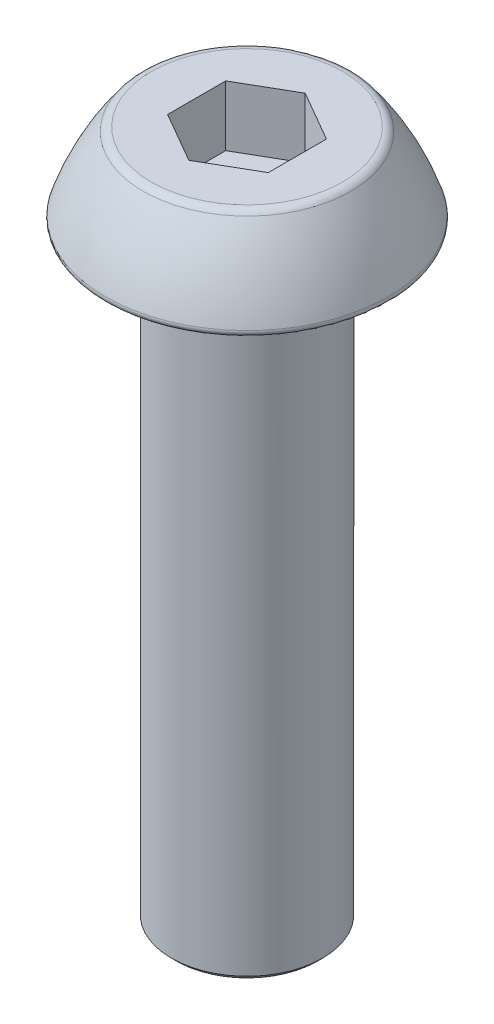
ISO-10303-21;
HEADER;
FILE_DESCRIPTION(('STEP AP214'),'2;1');
FILE_NAME('part.step','',(''),(''),'','','');
FILE_SCHEMA(('AUTOMOTIVE_DESIGN { 1 0 10303 214 1 1 1 1 }'));
ENDSEC;
DATA;
#1=APPLICATION_CONTEXT('core data for automotive mechanical design processes');
#2=APPLICATION_PROTOCOL_DEFINITION('international standard','automotive_design',2000,#1);
#3=PRODUCT_CONTEXT('',#1,'mechanical');
#4=PRODUCT('Part','Part','',(#3));
#5=PRODUCT_RELATED_PRODUCT_CATEGORY('part','',(#4));
#6=PRODUCT_DEFINITION_FORMATION('','',#4);
#7=PRODUCT_DEFINITION_CONTEXT('part definition',#1,'design');
#8=PRODUCT_DEFINITION('design','',#6,#7);
#9=PRODUCT_DEFINITION_SHAPE('','',#8);
#10=(LENGTH_UNIT() NAMED_UNIT(*) SI_UNIT(.MILLI.,.METRE.));
#11=(NAMED_UNIT(*) PLANE_ANGLE_UNIT() SI_UNIT($,.RADIAN.));
#12=(NAMED_UNIT(*) SI_UNIT($,.STERADIAN.) SOLID_ANGLE_UNIT());
#13=UNCERTAINTY_MEASURE_WITH_UNIT(LENGTH_MEASURE(1.E-05),#10,'distance_accuracy_value','');
#14=(GEOMETRIC_REPRESENTATION_CONTEXT(3) GLOBAL_UNCERTAINTY_ASSIGNED_CONTEXT((#13)) GLOBAL_UNIT_ASSIGNED_CONTEXT((#10,
#11,#12)) REPRESENTATION_CONTEXT('',''));
#15=CARTESIAN_POINT('',(0.,0.,0.));
#16=DIRECTION('',(0.,0.,1.));
#17=DIRECTION('',(1.,0.,0.));
#18=AXIS2_PLACEMENT_3D('',#15,#16,#17);
#19=CARTESIAN_POINT('',(0.,0.,0.));
#20=DIRECTION('',(0.,1.,0.));
#21=DIRECTION('',(0.,0.,1.));
#22=AXIS2_PLACEMENT_3D('',#19,#20,#21);
#23=PLANE('',#22);
#24=CARTESIAN_POINT('',(0.,0.,0.));
#25=DIRECTION('',(0.,1.,0.));
#26=DIRECTION('',(0.,0.,1.));
#27=AXIS2_PLACEMENT_3D('',#24,#25,#26);
#28=CIRCLE('',#27,2.71401101775283);
#29=CARTESIAN_POINT('',(0.,0.,2.71401101775283));
#30=VERTEX_POINT('',#29);
#31=EDGE_CURVE('E118',#30,#30,#28,.F.);
#32=ORIENTED_EDGE('',*,*,#31,.T.);
#33=EDGE_LOOP('',(#32));
#34=FACE_BOUND('',#33,.T.);
#35=CARTESIAN_POINT('',(0.,0.,0.));
#36=DIRECTION('',(0.,1.,0.));
#37=DIRECTION('',(0.,0.,1.));
#38=AXIS2_PLACEMENT_3D('',#35,#36,#37);
#39=CIRCLE('',#38,1.5);
#40=CARTESIAN_POINT('',(0.,0.,1.5));
#41=VERTEX_POINT('',#40);
#42=EDGE_CURVE('E137',#41,#41,#39,.F.);
#43=ORIENTED_EDGE('',*,*,#42,.F.);
#44=EDGE_LOOP('',(#43));
#45=FACE_BOUND('',#44,.T.);
#46=ADVANCED_FACE('F17',(#34,#45),#23,.F.);
#47=CARTESIAN_POINT('',(-2.,1.65,0.));
#48=DIRECTION('',(0.,-1.,0.));
#49=DIRECTION('',(0.,0.,-1.));
#50=AXIS2_PLACEMENT_3D('',#47,#48,#49);
#51=PLANE('',#50);
#52=DIRECTION('',(-0.866025403784439,0.,0.5));
#53=VECTOR('',#52,1.);
#54=CARTESIAN_POINT('',(0.,1.65,-1.15470053837925));
#55=LINE('',#54,#53);
#56=CARTESIAN_POINT('',(0.,1.65,-1.15470053837925));
#57=VERTEX_POINT('',#56);
#58=CARTESIAN_POINT('',(-1.,1.65,-0.577350269189626));
#59=VERTEX_POINT('',#58);
#60=EDGE_CURVE('E106',#57,#59,#55,.T.);
#61=ORIENTED_EDGE('',*,*,#60,.F.);
#62=DIRECTION('',(-0.866025403784439,0.,-0.5));
#63=VECTOR('',#62,1.);
#64=CARTESIAN_POINT('',(1.,1.65,-0.577350269189626));
#65=LINE('',#64,#63);
#66=CARTESIAN_POINT('',(1.,1.65,-0.577350269189626));
#67=VERTEX_POINT('',#66);
#68=EDGE_CURVE('E32',#67,#57,#65,.T.);
#69=ORIENTED_EDGE('',*,*,#68,.F.);
#70=DIRECTION('',(0.,0.,-1.));
#71=VECTOR('',#70,1.);
#72=CARTESIAN_POINT('',(1.,1.65,0.577350269189626));
#73=LINE('',#72,#71);
#74=CARTESIAN_POINT('',(1.,1.65,0.577350269189626));
#75=VERTEX_POINT('',#74);
#76=EDGE_CURVE('E113',#75,#67,#73,.T.);
#77=ORIENTED_EDGE('',*,*,#76,.F.);
#78=DIRECTION('',(0.866025403784439,0.,-0.5));
#79=VECTOR('',#78,1.);
#80=CARTESIAN_POINT('',(0.,1.65,1.15470053837925));
#81=LINE('',#80,#79);
#82=CARTESIAN_POINT('',(0.,1.65,1.15470053837925));
#83=VERTEX_POINT('',#82);
#84=EDGE_CURVE('E114',#83,#75,#81,.T.);
#85=ORIENTED_EDGE('',*,*,#84,.F.);
#86=DIRECTION('',(0.866025403784439,0.,0.5));
#87=VECTOR('',#86,1.);
#88=CARTESIAN_POINT('',(-1.,1.65,0.577350269189626));
#89=LINE('',#88,#87);
#90=CARTESIAN_POINT('',(-1.,1.65,0.577350269189626));
#91=VERTEX_POINT('',#90);
#92=EDGE_CURVE('E79',#91,#83,#89,.T.);
#93=ORIENTED_EDGE('',*,*,#92,.F.);
#94=DIRECTION('',(0.,0.,1.));
#95=VECTOR('',#94,1.);
#96=CARTESIAN_POINT('',(-1.,1.65,-0.577350269189626));
#97=LINE('',#96,#95);
#98=EDGE_CURVE('E108',#59,#91,#97,.T.);
#99=ORIENTED_EDGE('',*,*,#98,.F.);
#100=EDGE_LOOP('',(#61,#69,#77,#85,#93,#99));
#101=FACE_BOUND('',#100,.T.);
#102=CARTESIAN_POINT('',(0.,1.65,0.));
#103=DIRECTION('',(0.,-1.,0.));
#104=DIRECTION('',(0.,0.,-1.));
#105=AXIS2_PLACEMENT_3D('',#102,#103,#104);
#106=CIRCLE('',#105,1.90110924353599);
#107=CARTESIAN_POINT('',(0.,1.65,-1.90110924353599));
#108=VERTEX_POINT('',#107);
#109=EDGE_CURVE('E132',#108,#108,#106,.F.);
#110=ORIENTED_EDGE('',*,*,#109,.T.);
#111=EDGE_LOOP('',(#110));
#112=FACE_BOUND('',#111,.T.);
#113=ADVANCED_FACE('F152',(#101,#112),#51,.F.);
#114=CARTESIAN_POINT('',(0.,-1.42499576680782,0.));
#115=DIRECTION('',(0.,-1.,0.));
#116=DIRECTION('',(0.,0.,-1.));
#117=AXIS2_PLACEMENT_3D('',#114,#115,#116);
#118=DEGENERATE_TOROIDAL_SURFACE('',#117,1.94263884145048,5.,.F.);
#119=CARTESIAN_POINT('',(0.,1.56979149028366,0.));
#120=DIRECTION('',(0.,-1.,0.));
#121=DIRECTION('',(0.,0.,-1.));
#122=AXIS2_PLACEMENT_3D('',#119,#120,#121);
#123=CIRCLE('',#122,2.06126541374375);
#124=CARTESIAN_POINT('',(0.,1.56979149028366,-2.06126541374375));
#125=VERTEX_POINT('',#124);
#126=EDGE_CURVE('E129',#125,#125,#123,.T.);
#127=ORIENTED_EDGE('',*,*,#126,.T.);
#128=EDGE_LOOP('',(#127));
#129=FACE_BOUND('',#128,.T.);
#130=CARTESIAN_POINT('',(0.,0.131122362587915,0.));
#131=DIRECTION('',(0.,-1.,0.));
#132=DIRECTION('',(0.,0.,-1.));
#133=AXIS2_PLACEMENT_3D('',#130,#131,#132);
#134=CIRCLE('',#133,2.80904468834882);
#135=CARTESIAN_POINT('',(0.,0.131122362587915,-2.80904468834882));
#136=VERTEX_POINT('',#135);
#137=EDGE_CURVE('E126',#136,#136,#134,.F.);
#138=ORIENTED_EDGE('',*,*,#137,.T.);
#139=EDGE_LOOP('',(#138));
#140=FACE_BOUND('',#139,.T.);
#141=ADVANCED_FACE('F161',(#129,#140),#118,.F.);
#142=CARTESIAN_POINT('',(0.,0.1,0.));
#143=DIRECTION('',(0.,1.,0.));
#144=DIRECTION('',(0.,0.,1.));
#145=AXIS2_PLACEMENT_3D('',#142,#143,#144);
#146=TOROIDAL_SURFACE('',#145,2.71401101775283,0.1);
#147=ORIENTED_EDGE('',*,*,#137,.F.);
#148=EDGE_LOOP('',(#147));
#149=FACE_BOUND('',#148,.T.);
#150=ORIENTED_EDGE('',*,*,#31,.F.);
#151=EDGE_LOOP('',(#150));
#152=FACE_BOUND('',#151,.T.);
#153=ADVANCED_FACE('F168',(#149,#152),#146,.T.);
#154=CARTESIAN_POINT('',(0.,1.45,0.));
#155=DIRECTION('',(0.,-1.,0.));
#156=DIRECTION('',(0.,0.,-1.));
#157=AXIS2_PLACEMENT_3D('',#154,#155,#156);
#158=TOROIDAL_SURFACE('',#157,1.90110924353599,0.2);
#159=ORIENTED_EDGE('',*,*,#109,.F.);
#160=EDGE_LOOP('',(#159));
#161=FACE_BOUND('',#160,.T.);
#162=ORIENTED_EDGE('',*,*,#126,.F.);
#163=EDGE_LOOP('',(#162));
#164=FACE_BOUND('',#163,.T.);
#165=ADVANCED_FACE('F173',(#161,#164),#158,.T.);
#166=CARTESIAN_POINT('',(1.,0.45,-0.577350269189626));
#167=DIRECTION('',(0.5,0.,-0.866025403784439));
#168=DIRECTION('',(-0.866025403784439,0.,-0.5));
#169=AXIS2_PLACEMENT_3D('',#166,#167,#168);
#170=PLANE('',#169);
#171=ORIENTED_EDGE('',*,*,#68,.T.);
#172=DIRECTION('',(0.,1.,0.));
#173=VECTOR('',#172,1.);
#174=CARTESIAN_POINT('',(0.,0.45,-1.15470053837925));
#175=LINE('',#174,#173);
#176=CARTESIAN_POINT('',(0.,0.45,-1.15470053837925));
#177=VERTEX_POINT('',#176);
#178=EDGE_CURVE('E62',#177,#57,#175,.T.);
#179=ORIENTED_EDGE('',*,*,#178,.F.);
#180=DIRECTION('',(-0.866025403784439,0.,-0.5));
#181=VECTOR('',#180,1.);
#182=CARTESIAN_POINT('',(1.,0.45,-0.577350269189626));
#183=LINE('',#182,#181);
#184=CARTESIAN_POINT('',(1.,0.45,-0.577350269189626));
#185=VERTEX_POINT('',#184);
#186=EDGE_CURVE('E117',#185,#177,#183,.T.);
#187=ORIENTED_EDGE('',*,*,#186,.F.);
#188=DIRECTION('',(0.,1.,0.));
#189=VECTOR('',#188,1.);
#190=CARTESIAN_POINT('',(1.,0.45,-0.577350269189626));
#191=LINE('',#190,#189);
#192=EDGE_CURVE('E37',#185,#67,#191,.T.);
#193=ORIENTED_EDGE('',*,*,#192,.T.);
#194=EDGE_LOOP('',(#171,#179,#187,#193));
#195=FACE_BOUND('',#194,.T.);
#196=ADVANCED_FACE('F170',(#195),#170,.F.);
#197=CARTESIAN_POINT('',(1.,0.45,0.577350269189626));
#198=DIRECTION('',(1.,0.,0.));
#199=DIRECTION('',(0.,0.,-1.));
#200=AXIS2_PLACEMENT_3D('',#197,#198,#199);
#201=PLANE('',#200);
#202=ORIENTED_EDGE('',*,*,#76,.T.);
#203=ORIENTED_EDGE('',*,*,#192,.F.);
#204=DIRECTION('',(0.,0.,-1.));
#205=VECTOR('',#204,1.);
#206=CARTESIAN_POINT('',(1.,0.45,0.577350269189626));
#207=LINE('',#206,#205);
#208=CARTESIAN_POINT('',(1.,0.45,0.577350269189626));
#209=VERTEX_POINT('',#208);
#210=EDGE_CURVE('E95',#209,#185,#207,.T.);
#211=ORIENTED_EDGE('',*,*,#210,.F.);
#212=DIRECTION('',(0.,1.,0.));
#213=VECTOR('',#212,1.);
#214=CARTESIAN_POINT('',(1.,0.45,0.577350269189626));
#215=LINE('',#214,#213);
#216=EDGE_CURVE('E81',#209,#75,#215,.T.);
#217=ORIENTED_EDGE('',*,*,#216,.T.);
#218=EDGE_LOOP('',(#202,#203,#211,#217));
#219=FACE_BOUND('',#218,.T.);
#220=ADVANCED_FACE('F181',(#219),#201,.F.);
#221=CARTESIAN_POINT('',(0.,0.45,1.15470053837925));
#222=DIRECTION('',(0.5,0.,0.866025403784439));
#223=DIRECTION('',(0.866025403784439,0.,-0.5));
#224=AXIS2_PLACEMENT_3D('',#221,#222,#223);
#225=PLANE('',#224);
#226=ORIENTED_EDGE('',*,*,#84,.T.);
#227=ORIENTED_EDGE('',*,*,#216,.F.);
#228=DIRECTION('',(0.866025403784439,0.,-0.5));
#229=VECTOR('',#228,1.);
#230=CARTESIAN_POINT('',(0.,0.45,1.15470053837925));
#231=LINE('',#230,#229);
#232=CARTESIAN_POINT('',(0.,0.45,1.15470053837925));
#233=VERTEX_POINT('',#232);
#234=EDGE_CURVE('E86',#233,#209,#231,.T.);
#235=ORIENTED_EDGE('',*,*,#234,.F.);
#236=DIRECTION('',(0.,1.,0.));
#237=VECTOR('',#236,1.);
#238=CARTESIAN_POINT('',(0.,0.45,1.15470053837925));
#239=LINE('',#238,#237);
#240=EDGE_CURVE('E73',#233,#83,#239,.T.);
#241=ORIENTED_EDGE('',*,*,#240,.T.);
#242=EDGE_LOOP('',(#226,#227,#235,#241));
#243=FACE_BOUND('',#242,.T.);
#244=ADVANCED_FACE('F90',(#243),#225,.F.);
#245=CARTESIAN_POINT('',(-1.,0.45,0.577350269189626));
#246=DIRECTION('',(-0.5,0.,0.866025403784439));
#247=DIRECTION('',(0.866025403784439,0.,0.5));
#248=AXIS2_PLACEMENT_3D('',#245,#246,#247);
#249=PLANE('',#248);
#250=ORIENTED_EDGE('',*,*,#92,.T.);
#251=ORIENTED_EDGE('',*,*,#240,.F.);
#252=DIRECTION('',(0.866025403784439,0.,0.5));
#253=VECTOR('',#252,1.);
#254=CARTESIAN_POINT('',(-1.,0.45,0.577350269189626));
#255=LINE('',#254,#253);
#256=CARTESIAN_POINT('',(-1.,0.45,0.577350269189626));
#257=VERTEX_POINT('',#256);
#258=EDGE_CURVE('E80',#257,#233,#255,.T.);
#259=ORIENTED_EDGE('',*,*,#258,.F.);
#260=DIRECTION('',(0.,1.,0.));
#261=VECTOR('',#260,1.);
#262=CARTESIAN_POINT('',(-1.,0.45,0.577350269189626));
#263=LINE('',#262,#261);
#264=EDGE_CURVE('E83',#257,#91,#263,.T.);
#265=ORIENTED_EDGE('',*,*,#264,.T.);
#266=EDGE_LOOP('',(#250,#251,#259,#265));
#267=FACE_BOUND('',#266,.T.);
#268=ADVANCED_FACE('F74',(#267),#249,.F.);
#269=CARTESIAN_POINT('',(-1.,0.45,-0.577350269189626));
#270=DIRECTION('',(-1.,0.,0.));
#271=DIRECTION('',(0.,0.,1.));
#272=AXIS2_PLACEMENT_3D('',#269,#270,#271);
#273=PLANE('',#272);
#274=ORIENTED_EDGE('',*,*,#98,.T.);
#275=ORIENTED_EDGE('',*,*,#264,.F.);
#276=DIRECTION('',(0.,0.,1.));
#277=VECTOR('',#276,1.);
#278=CARTESIAN_POINT('',(-1.,0.45,-0.577350269189626));
#279=LINE('',#278,#277);
#280=CARTESIAN_POINT('',(-1.,0.45,-0.577350269189626));
#281=VERTEX_POINT('',#280);
#282=EDGE_CURVE('E98',#281,#257,#279,.T.);
#283=ORIENTED_EDGE('',*,*,#282,.F.);
#284=DIRECTION('',(0.,1.,0.));
#285=VECTOR('',#284,1.);
#286=CARTESIAN_POINT('',(-1.,0.45,-0.577350269189626));
#287=LINE('',#286,#285);
#288=EDGE_CURVE('E121',#281,#59,#287,.T.);
#289=ORIENTED_EDGE('',*,*,#288,.T.);
#290=EDGE_LOOP('',(#274,#275,#283,#289));
#291=FACE_BOUND('',#290,.T.);
#292=ADVANCED_FACE('F206',(#291),#273,.F.);
#293=CARTESIAN_POINT('',(0.,0.45,-1.15470053837925));
#294=DIRECTION('',(-0.5,0.,-0.866025403784439));
#295=DIRECTION('',(-0.866025403784439,0.,0.5));
#296=AXIS2_PLACEMENT_3D('',#293,#294,#295);
#297=PLANE('',#296);
#298=ORIENTED_EDGE('',*,*,#60,.T.);
#299=ORIENTED_EDGE('',*,*,#288,.F.);
#300=DIRECTION('',(-0.866025403784439,0.,0.5));
#301=VECTOR('',#300,1.);
#302=CARTESIAN_POINT('',(0.,0.45,-1.15470053837925));
#303=LINE('',#302,#301);
#304=EDGE_CURVE('E99',#177,#281,#303,.T.);
#305=ORIENTED_EDGE('',*,*,#304,.F.);
#306=ORIENTED_EDGE('',*,*,#178,.T.);
#307=EDGE_LOOP('',(#298,#299,#305,#306));
#308=FACE_BOUND('',#307,.T.);
#309=ADVANCED_FACE('F208',(#308),#297,.F.);
#310=CARTESIAN_POINT('',(0.,0.45,0.));
#311=DIRECTION('',(0.,1.,0.));
#312=DIRECTION('',(0.,0.,1.));
#313=AXIS2_PLACEMENT_3D('',#310,#311,#312);
#314=PLANE('',#313);
#315=ORIENTED_EDGE('',*,*,#186,.T.);
#316=ORIENTED_EDGE('',*,*,#304,.T.);
#317=ORIENTED_EDGE('',*,*,#282,.T.);
#318=ORIENTED_EDGE('',*,*,#258,.T.);
#319=ORIENTED_EDGE('',*,*,#234,.T.);
#320=ORIENTED_EDGE('',*,*,#210,.T.);
#321=EDGE_LOOP('',(#315,#316,#317,#318,#319,#320));
#322=FACE_BOUND('',#321,.T.);
#323=ADVANCED_FACE('F92',(#322),#314,.T.);
#324=CARTESIAN_POINT('',(0.,-12.,0.));
#325=DIRECTION('',(0.,1.,0.));
#326=DIRECTION('',(0.,0.,1.));
#327=AXIS2_PLACEMENT_3D('',#324,#325,#326);
#328=CYLINDRICAL_SURFACE('',#327,1.5);
#329=CARTESIAN_POINT('',(0.,-11.9,0.));
#330=DIRECTION('',(0.,-1.,0.));
#331=DIRECTION('',(0.,0.,-1.));
#332=AXIS2_PLACEMENT_3D('',#329,#330,#331);
#333=CIRCLE('',#332,1.5);
#334=CARTESIAN_POINT('',(0.,-11.9,-1.5));
#335=VERTEX_POINT('',#334);
#336=EDGE_CURVE('E11',#335,#335,#333,.F.);
#337=ORIENTED_EDGE('',*,*,#336,.T.);
#338=EDGE_LOOP('',(#337));
#339=FACE_BOUND('',#338,.T.);
#340=ORIENTED_EDGE('',*,*,#42,.T.);
#341=EDGE_LOOP('',(#340));
#342=FACE_BOUND('',#341,.T.);
#343=ADVANCED_FACE('F147',(#339,#342),#328,.T.);
#344=CARTESIAN_POINT('',(0.,-12.,0.));
#345=DIRECTION('',(0.,-1.,0.));
#346=DIRECTION('',(0.,0.,-1.));
#347=AXIS2_PLACEMENT_3D('',#344,#345,#346);
#348=PLANE('',#347);
#349=CARTESIAN_POINT('',(0.,-12.,0.));
#350=DIRECTION('',(0.,-1.,0.));
#351=DIRECTION('',(0.,0.,-1.));
#352=AXIS2_PLACEMENT_3D('',#349,#350,#351);
#353=CIRCLE('',#352,1.4);
#354=CARTESIAN_POINT('',(0.,-12.,-1.4));
#355=VERTEX_POINT('',#354);
#356=EDGE_CURVE('E25',#355,#355,#353,.T.);
#357=ORIENTED_EDGE('',*,*,#356,.T.);
#358=EDGE_LOOP('',(#357));
#359=FACE_BOUND('',#358,.T.);
#360=ADVANCED_FACE('F143',(#359),#348,.T.);
#361=CARTESIAN_POINT('',(0.,-12.,0.));
#362=DIRECTION('',(0.,1.,0.));
#363=DIRECTION('',(0.,0.,1.));
#364=AXIS2_PLACEMENT_3D('',#361,#362,#363);
#365=CONICAL_SURFACE('',#364,1.4,0.785398163397452);
#366=ORIENTED_EDGE('',*,*,#336,.F.);
#367=EDGE_LOOP('',(#366));
#368=FACE_BOUND('',#367,.T.);
#369=ORIENTED_EDGE('',*,*,#356,.F.);
#370=EDGE_LOOP('',(#369));
#371=FACE_BOUND('',#370,.T.);
#372=ADVANCED_FACE('F19',(#368,#371),#365,.T.);
#373=CLOSED_SHELL('',(#46,#113,#141,#153,#165,#196,#220,#244,#268,#292,#309,#323,#343,#360,#372));
#374=MANIFOLD_SOLID_BREP('B1',#373);
#375=ADVANCED_BREP_SHAPE_REPRESENTATION('',(#18,#374),#14);
#376=SHAPE_DEFINITION_REPRESENTATION(#9,#375);
ENDSEC;
END-ISO-10303-21;
